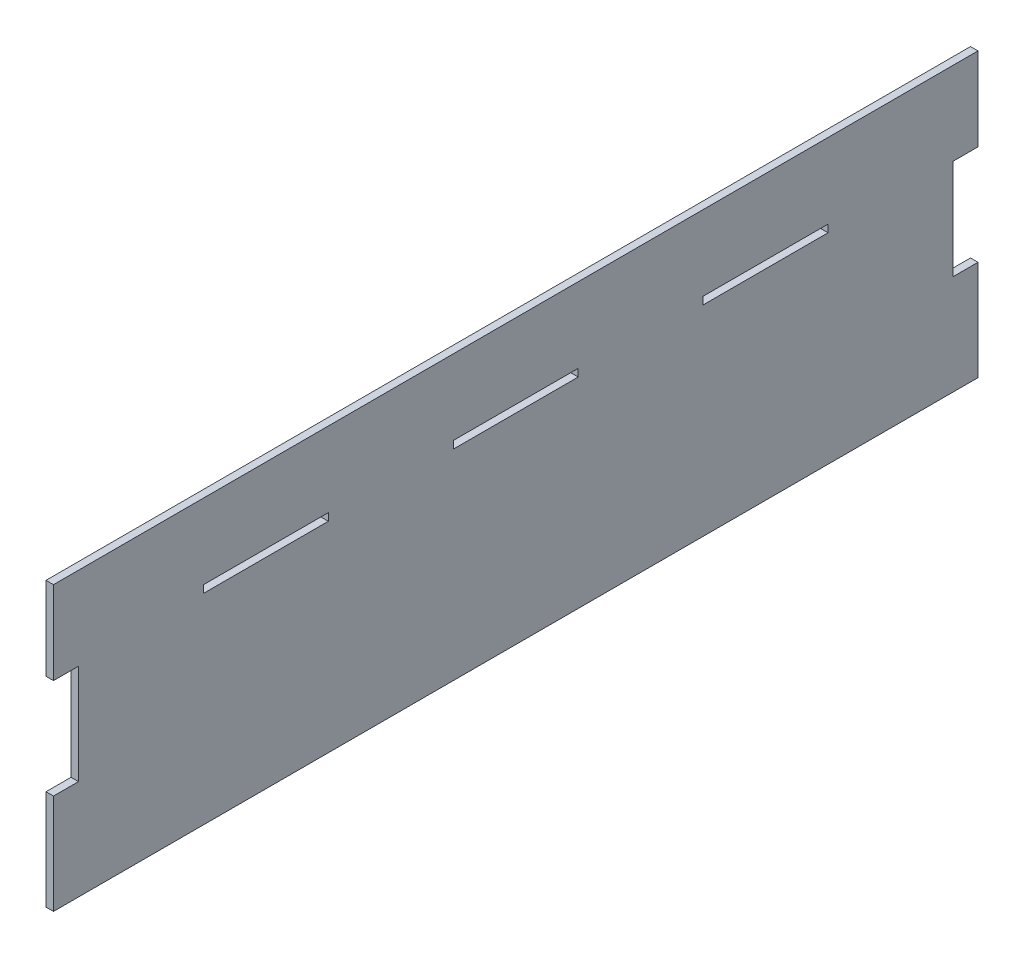
ISO-10303-21;
HEADER;
FILE_DESCRIPTION(('STEP AP214'),'2;1');
FILE_NAME('part.step','',(''),(''),'','','');
FILE_SCHEMA(('AUTOMOTIVE_DESIGN { 1 0 10303 214 1 1 1 1 }'));
ENDSEC;
DATA;
#1=APPLICATION_CONTEXT('core data for automotive mechanical design processes');
#2=APPLICATION_PROTOCOL_DEFINITION('international standard','automotive_design',2000,#1);
#3=PRODUCT_CONTEXT('',#1,'mechanical');
#4=PRODUCT('Part','Part','',(#3));
#5=PRODUCT_RELATED_PRODUCT_CATEGORY('part','',(#4));
#6=PRODUCT_DEFINITION_FORMATION('','',#4);
#7=PRODUCT_DEFINITION_CONTEXT('part definition',#1,'design');
#8=PRODUCT_DEFINITION('design','',#6,#7);
#9=PRODUCT_DEFINITION_SHAPE('','',#8);
#10=(LENGTH_UNIT() NAMED_UNIT(*) SI_UNIT(.MILLI.,.METRE.));
#11=(NAMED_UNIT(*) PLANE_ANGLE_UNIT() SI_UNIT($,.RADIAN.));
#12=(NAMED_UNIT(*) SI_UNIT($,.STERADIAN.) SOLID_ANGLE_UNIT());
#13=UNCERTAINTY_MEASURE_WITH_UNIT(LENGTH_MEASURE(1.E-05),#10,'distance_accuracy_value','');
#14=(GEOMETRIC_REPRESENTATION_CONTEXT(3) GLOBAL_UNCERTAINTY_ASSIGNED_CONTEXT((#13)) GLOBAL_UNIT_ASSIGNED_CONTEXT((#10,
#11,#12)) REPRESENTATION_CONTEXT('',''));
#15=CARTESIAN_POINT('',(0.,0.,0.));
#16=DIRECTION('',(0.,0.,1.));
#17=DIRECTION('',(1.,0.,0.));
#18=AXIS2_PLACEMENT_3D('',#15,#16,#17);
#19=CARTESIAN_POINT('',(3.,0.,0.));
#20=DIRECTION('',(-1.,0.,0.));
#21=DIRECTION('',(0.,0.,1.));
#22=AXIS2_PLACEMENT_3D('',#19,#20,#21);
#23=PLANE('',#22);
#24=DIRECTION('',(0.,-1.,0.));
#25=VECTOR('',#24,1.);
#26=CARTESIAN_POINT('',(3.,57.3835294117648,25.));
#27=LINE('',#26,#25);
#28=CARTESIAN_POINT('',(3.,60.3835294117648,25.));
#29=VERTEX_POINT('',#28);
#30=CARTESIAN_POINT('',(3.,57.3835294117648,25.));
#31=VERTEX_POINT('',#30);
#32=EDGE_CURVE('E249',#29,#31,#27,.T.);
#33=ORIENTED_EDGE('',*,*,#32,.F.);
#34=DIRECTION('',(0.,0.,1.));
#35=VECTOR('',#34,1.);
#36=CARTESIAN_POINT('',(3.,60.3835294117648,25.));
#37=LINE('',#36,#35);
#38=CARTESIAN_POINT('',(3.,60.3835294117648,-25.));
#39=VERTEX_POINT('',#38);
#40=EDGE_CURVE('E260',#39,#29,#37,.T.);
#41=ORIENTED_EDGE('',*,*,#40,.F.);
#42=DIRECTION('',(0.,1.,0.));
#43=VECTOR('',#42,1.);
#44=CARTESIAN_POINT('',(3.,57.3835294117648,-25.));
#45=LINE('',#44,#43);
#46=CARTESIAN_POINT('',(3.,57.3835294117648,-25.));
#47=VERTEX_POINT('',#46);
#48=EDGE_CURVE('E256',#47,#39,#45,.T.);
#49=ORIENTED_EDGE('',*,*,#48,.F.);
#50=DIRECTION('',(0.,0.,-1.));
#51=VECTOR('',#50,1.);
#52=CARTESIAN_POINT('',(3.,57.3835294117648,25.));
#53=LINE('',#52,#51);
#54=EDGE_CURVE('E252',#31,#47,#53,.T.);
#55=ORIENTED_EDGE('',*,*,#54,.F.);
#56=EDGE_LOOP('',(#33,#41,#49,#55));
#57=FACE_BOUND('',#56,.T.);
#58=DIRECTION('',(0.,-1.,0.));
#59=VECTOR('',#58,1.);
#60=CARTESIAN_POINT('',(3.,90.4235294117647,185.));
#61=LINE('',#60,#59);
#62=CARTESIAN_POINT('',(3.,90.4235294117647,185.));
#63=VERTEX_POINT('',#62);
#64=CARTESIAN_POINT('',(3.,57.1535294117648,185.));
#65=VERTEX_POINT('',#64);
#66=EDGE_CURVE('E335',#63,#65,#61,.T.);
#67=ORIENTED_EDGE('',*,*,#66,.T.);
#68=DIRECTION('',(0.,0.,-1.));
#69=VECTOR('',#68,1.);
#70=CARTESIAN_POINT('',(3.,57.1535294117648,175.));
#71=LINE('',#70,#69);
#72=CARTESIAN_POINT('',(3.,57.1535294117648,175.));
#73=VERTEX_POINT('',#72);
#74=EDGE_CURVE('E339',#65,#73,#71,.T.);
#75=ORIENTED_EDGE('',*,*,#74,.T.);
#76=DIRECTION('',(0.,-1.,0.));
#77=VECTOR('',#76,1.);
#78=CARTESIAN_POINT('',(3.,17.1535294117647,175.));
#79=LINE('',#78,#77);
#80=CARTESIAN_POINT('',(3.,17.1535294117647,175.));
#81=VERTEX_POINT('',#80);
#82=EDGE_CURVE('E343',#73,#81,#79,.T.);
#83=ORIENTED_EDGE('',*,*,#82,.T.);
#84=DIRECTION('',(0.,0.,1.));
#85=VECTOR('',#84,1.);
#86=CARTESIAN_POINT('',(3.,17.1535294117647,185.));
#87=LINE('',#86,#85);
#88=CARTESIAN_POINT('',(3.,17.1535294117647,185.));
#89=VERTEX_POINT('',#88);
#90=EDGE_CURVE('E346',#81,#89,#87,.T.);
#91=ORIENTED_EDGE('',*,*,#90,.T.);
#92=DIRECTION('',(0.,-1.,0.));
#93=VECTOR('',#92,1.);
#94=CARTESIAN_POINT('',(3.,17.1535294117647,185.));
#95=LINE('',#94,#93);
#96=CARTESIAN_POINT('',(3.,-22.8464705882353,185.));
#97=VERTEX_POINT('',#96);
#98=EDGE_CURVE('E349',#89,#97,#95,.T.);
#99=ORIENTED_EDGE('',*,*,#98,.T.);
#100=DIRECTION('',(0.,0.,-1.));
#101=VECTOR('',#100,1.);
#102=CARTESIAN_POINT('',(3.,-22.8464705882353,185.));
#103=LINE('',#102,#101);
#104=CARTESIAN_POINT('',(3.,-22.8464705882352,-185.));
#105=VERTEX_POINT('',#104);
#106=EDGE_CURVE('E352',#97,#105,#103,.T.);
#107=ORIENTED_EDGE('',*,*,#106,.T.);
#108=DIRECTION('',(0.,1.,0.));
#109=VECTOR('',#108,1.);
#110=CARTESIAN_POINT('',(3.,17.1535294117648,-185.));
#111=LINE('',#110,#109);
#112=CARTESIAN_POINT('',(3.,17.1535294117648,-185.));
#113=VERTEX_POINT('',#112);
#114=EDGE_CURVE('E355',#105,#113,#111,.T.);
#115=ORIENTED_EDGE('',*,*,#114,.T.);
#116=DIRECTION('',(0.,0.,1.));
#117=VECTOR('',#116,1.);
#118=CARTESIAN_POINT('',(3.,17.1535294117648,-185.));
#119=LINE('',#118,#117);
#120=CARTESIAN_POINT('',(3.,17.1535294117648,-175.));
#121=VERTEX_POINT('',#120);
#122=EDGE_CURVE('E358',#113,#121,#119,.T.);
#123=ORIENTED_EDGE('',*,*,#122,.T.);
#124=DIRECTION('',(0.,1.,0.));
#125=VECTOR('',#124,1.);
#126=CARTESIAN_POINT('',(3.,17.1535294117648,-175.));
#127=LINE('',#126,#125);
#128=CARTESIAN_POINT('',(3.,57.1535294117648,-175.));
#129=VERTEX_POINT('',#128);
#130=EDGE_CURVE('E361',#121,#129,#127,.T.);
#131=ORIENTED_EDGE('',*,*,#130,.T.);
#132=DIRECTION('',(0.,0.,-1.));
#133=VECTOR('',#132,1.);
#134=CARTESIAN_POINT('',(3.,57.1535294117648,-175.));
#135=LINE('',#134,#133);
#136=CARTESIAN_POINT('',(3.,57.1535294117648,-185.));
#137=VERTEX_POINT('',#136);
#138=EDGE_CURVE('E364',#129,#137,#135,.T.);
#139=ORIENTED_EDGE('',*,*,#138,.T.);
#140=DIRECTION('',(0.,1.,0.));
#141=VECTOR('',#140,1.);
#142=CARTESIAN_POINT('',(3.,90.4235294117648,-185.));
#143=LINE('',#142,#141);
#144=CARTESIAN_POINT('',(3.,90.4235294117648,-185.));
#145=VERTEX_POINT('',#144);
#146=EDGE_CURVE('E367',#137,#145,#143,.T.);
#147=ORIENTED_EDGE('',*,*,#146,.T.);
#148=DIRECTION('',(0.,0.,1.));
#149=VECTOR('',#148,1.);
#150=CARTESIAN_POINT('',(3.,90.4235294117648,-185.));
#151=LINE('',#150,#149);
#152=EDGE_CURVE('E370',#145,#63,#151,.T.);
#153=ORIENTED_EDGE('',*,*,#152,.T.);
#154=EDGE_LOOP('',(#67,#75,#83,#91,#99,#107,#115,#123,#131,#139,#147,#153));
#155=FACE_BOUND('',#154,.T.);
#156=DIRECTION('',(0.,-1.,0.));
#157=VECTOR('',#156,1.);
#158=CARTESIAN_POINT('',(3.,57.3835294117648,125.));
#159=LINE('',#158,#157);
#160=CARTESIAN_POINT('',(3.,60.3835294117648,125.));
#161=VERTEX_POINT('',#160);
#162=CARTESIAN_POINT('',(3.,57.3835294117648,125.));
#163=VERTEX_POINT('',#162);
#164=EDGE_CURVE('E292',#161,#163,#159,.T.);
#165=ORIENTED_EDGE('',*,*,#164,.F.);
#166=DIRECTION('',(0.,0.,1.));
#167=VECTOR('',#166,1.);
#168=CARTESIAN_POINT('',(3.,60.3835294117648,125.));
#169=LINE('',#168,#167);
#170=CARTESIAN_POINT('',(3.,60.3835294117648,75.));
#171=VERTEX_POINT('',#170);
#172=EDGE_CURVE('E303',#171,#161,#169,.T.);
#173=ORIENTED_EDGE('',*,*,#172,.F.);
#174=DIRECTION('',(0.,1.,0.));
#175=VECTOR('',#174,1.);
#176=CARTESIAN_POINT('',(3.,57.3835294117648,75.));
#177=LINE('',#176,#175);
#178=CARTESIAN_POINT('',(3.,57.3835294117648,75.));
#179=VERTEX_POINT('',#178);
#180=EDGE_CURVE('E299',#179,#171,#177,.T.);
#181=ORIENTED_EDGE('',*,*,#180,.F.);
#182=DIRECTION('',(0.,0.,-1.));
#183=VECTOR('',#182,1.);
#184=CARTESIAN_POINT('',(3.,57.3835294117648,125.));
#185=LINE('',#184,#183);
#186=EDGE_CURVE('E295',#163,#179,#185,.T.);
#187=ORIENTED_EDGE('',*,*,#186,.F.);
#188=EDGE_LOOP('',(#165,#173,#181,#187));
#189=FACE_BOUND('',#188,.T.);
#190=DIRECTION('',(0.,-1.,0.));
#191=VECTOR('',#190,1.);
#192=CARTESIAN_POINT('',(3.,57.3835294117648,-75.));
#193=LINE('',#192,#191);
#194=CARTESIAN_POINT('',(3.,60.3835294117648,-75.));
#195=VERTEX_POINT('',#194);
#196=CARTESIAN_POINT('',(3.,57.3835294117648,-75.));
#197=VERTEX_POINT('',#196);
#198=EDGE_CURVE('E201',#195,#197,#193,.T.);
#199=ORIENTED_EDGE('',*,*,#198,.F.);
#200=DIRECTION('',(0.,0.,1.));
#201=VECTOR('',#200,1.);
#202=CARTESIAN_POINT('',(3.,60.3835294117648,-75.));
#203=LINE('',#202,#201);
#204=CARTESIAN_POINT('',(3.,60.3835294117648,-125.));
#205=VERTEX_POINT('',#204);
#206=EDGE_CURVE('E227',#205,#195,#203,.T.);
#207=ORIENTED_EDGE('',*,*,#206,.F.);
#208=DIRECTION('',(0.,1.,0.));
#209=VECTOR('',#208,1.);
#210=CARTESIAN_POINT('',(3.,57.3835294117648,-125.));
#211=LINE('',#210,#209);
#212=CARTESIAN_POINT('',(3.,57.3835294117648,-125.));
#213=VERTEX_POINT('',#212);
#214=EDGE_CURVE('E223',#213,#205,#211,.T.);
#215=ORIENTED_EDGE('',*,*,#214,.F.);
#216=DIRECTION('',(0.,0.,-1.));
#217=VECTOR('',#216,1.);
#218=CARTESIAN_POINT('',(3.,57.3835294117648,-75.));
#219=LINE('',#218,#217);
#220=EDGE_CURVE('E210',#197,#213,#219,.T.);
#221=ORIENTED_EDGE('',*,*,#220,.F.);
#222=EDGE_LOOP('',(#199,#207,#215,#221));
#223=FACE_BOUND('',#222,.T.);
#224=ADVANCED_FACE('F39',(#57,#155,#189,#223),#23,.F.);
#225=CARTESIAN_POINT('',(0.,0.,0.));
#226=DIRECTION('',(-1.,0.,0.));
#227=DIRECTION('',(0.,0.,1.));
#228=AXIS2_PLACEMENT_3D('',#225,#226,#227);
#229=PLANE('',#228);
#230=DIRECTION('',(0.,-1.,0.));
#231=VECTOR('',#230,1.);
#232=CARTESIAN_POINT('',(0.,90.4235294117647,185.));
#233=LINE('',#232,#231);
#234=CARTESIAN_POINT('',(0.,90.4235294117647,185.));
#235=VERTEX_POINT('',#234);
#236=CARTESIAN_POINT('',(0.,57.1535294117648,185.));
#237=VERTEX_POINT('',#236);
#238=EDGE_CURVE('E334',#235,#237,#233,.T.);
#239=ORIENTED_EDGE('',*,*,#238,.F.);
#240=DIRECTION('',(0.,0.,1.));
#241=VECTOR('',#240,1.);
#242=CARTESIAN_POINT('',(0.,90.4235294117648,-185.));
#243=LINE('',#242,#241);
#244=CARTESIAN_POINT('',(0.,90.4235294117648,-185.));
#245=VERTEX_POINT('',#244);
#246=EDGE_CURVE('E340',#245,#235,#243,.T.);
#247=ORIENTED_EDGE('',*,*,#246,.F.);
#248=DIRECTION('',(0.,1.,0.));
#249=VECTOR('',#248,1.);
#250=CARTESIAN_POINT('',(0.,90.4235294117648,-185.));
#251=LINE('',#250,#249);
#252=CARTESIAN_POINT('',(0.,57.1535294117648,-185.));
#253=VERTEX_POINT('',#252);
#254=EDGE_CURVE('E404',#253,#245,#251,.T.);
#255=ORIENTED_EDGE('',*,*,#254,.F.);
#256=DIRECTION('',(0.,0.,-1.));
#257=VECTOR('',#256,1.);
#258=CARTESIAN_POINT('',(0.,57.1535294117648,-175.));
#259=LINE('',#258,#257);
#260=CARTESIAN_POINT('',(0.,57.1535294117648,-175.));
#261=VERTEX_POINT('',#260);
#262=EDGE_CURVE('E401',#261,#253,#259,.T.);
#263=ORIENTED_EDGE('',*,*,#262,.F.);
#264=DIRECTION('',(0.,1.,0.));
#265=VECTOR('',#264,1.);
#266=CARTESIAN_POINT('',(0.,17.1535294117648,-175.));
#267=LINE('',#266,#265);
#268=CARTESIAN_POINT('',(0.,17.1535294117648,-175.));
#269=VERTEX_POINT('',#268);
#270=EDGE_CURVE('E398',#269,#261,#267,.T.);
#271=ORIENTED_EDGE('',*,*,#270,.F.);
#272=DIRECTION('',(0.,0.,1.));
#273=VECTOR('',#272,1.);
#274=CARTESIAN_POINT('',(0.,17.1535294117648,-185.));
#275=LINE('',#274,#273);
#276=CARTESIAN_POINT('',(0.,17.1535294117648,-185.));
#277=VERTEX_POINT('',#276);
#278=EDGE_CURVE('E395',#277,#269,#275,.T.);
#279=ORIENTED_EDGE('',*,*,#278,.F.);
#280=DIRECTION('',(0.,1.,0.));
#281=VECTOR('',#280,1.);
#282=CARTESIAN_POINT('',(0.,17.1535294117648,-185.));
#283=LINE('',#282,#281);
#284=CARTESIAN_POINT('',(0.,-22.8464705882352,-185.));
#285=VERTEX_POINT('',#284);
#286=EDGE_CURVE('E392',#285,#277,#283,.T.);
#287=ORIENTED_EDGE('',*,*,#286,.F.);
#288=DIRECTION('',(0.,0.,-1.));
#289=VECTOR('',#288,1.);
#290=CARTESIAN_POINT('',(0.,-22.8464705882353,185.));
#291=LINE('',#290,#289);
#292=CARTESIAN_POINT('',(0.,-22.8464705882353,185.));
#293=VERTEX_POINT('',#292);
#294=EDGE_CURVE('E389',#293,#285,#291,.T.);
#295=ORIENTED_EDGE('',*,*,#294,.F.);
#296=DIRECTION('',(0.,-1.,0.));
#297=VECTOR('',#296,1.);
#298=CARTESIAN_POINT('',(0.,17.1535294117647,185.));
#299=LINE('',#298,#297);
#300=CARTESIAN_POINT('',(0.,17.1535294117647,185.));
#301=VERTEX_POINT('',#300);
#302=EDGE_CURVE('E386',#301,#293,#299,.T.);
#303=ORIENTED_EDGE('',*,*,#302,.F.);
#304=DIRECTION('',(0.,0.,1.));
#305=VECTOR('',#304,1.);
#306=CARTESIAN_POINT('',(0.,17.1535294117647,185.));
#307=LINE('',#306,#305);
#308=CARTESIAN_POINT('',(0.,17.1535294117647,175.));
#309=VERTEX_POINT('',#308);
#310=EDGE_CURVE('E383',#309,#301,#307,.T.);
#311=ORIENTED_EDGE('',*,*,#310,.F.);
#312=DIRECTION('',(0.,-1.,0.));
#313=VECTOR('',#312,1.);
#314=CARTESIAN_POINT('',(0.,17.1535294117647,175.));
#315=LINE('',#314,#313);
#316=CARTESIAN_POINT('',(0.,57.1535294117648,175.));
#317=VERTEX_POINT('',#316);
#318=EDGE_CURVE('E380',#317,#309,#315,.T.);
#319=ORIENTED_EDGE('',*,*,#318,.F.);
#320=DIRECTION('',(0.,0.,-1.));
#321=VECTOR('',#320,1.);
#322=CARTESIAN_POINT('',(0.,57.1535294117648,175.));
#323=LINE('',#322,#321);
#324=EDGE_CURVE('E377',#237,#317,#323,.T.);
#325=ORIENTED_EDGE('',*,*,#324,.F.);
#326=EDGE_LOOP('',(#239,#247,#255,#263,#271,#279,#287,#295,#303,#311,#319,#325));
#327=FACE_BOUND('',#326,.T.);
#328=DIRECTION('',(0.,0.,1.));
#329=VECTOR('',#328,1.);
#330=CARTESIAN_POINT('',(0.,60.3835294117648,125.));
#331=LINE('',#330,#329);
#332=CARTESIAN_POINT('',(0.,60.3835294117648,75.));
#333=VERTEX_POINT('',#332);
#334=CARTESIAN_POINT('',(0.,60.3835294117648,125.));
#335=VERTEX_POINT('',#334);
#336=EDGE_CURVE('E296',#333,#335,#331,.T.);
#337=ORIENTED_EDGE('',*,*,#336,.T.);
#338=DIRECTION('',(0.,-1.,0.));
#339=VECTOR('',#338,1.);
#340=CARTESIAN_POINT('',(0.,57.3835294117648,125.));
#341=LINE('',#340,#339);
#342=CARTESIAN_POINT('',(0.,57.3835294117648,125.));
#343=VERTEX_POINT('',#342);
#344=EDGE_CURVE('E291',#335,#343,#341,.T.);
#345=ORIENTED_EDGE('',*,*,#344,.T.);
#346=DIRECTION('',(0.,0.,-1.));
#347=VECTOR('',#346,1.);
#348=CARTESIAN_POINT('',(0.,57.3835294117648,125.));
#349=LINE('',#348,#347);
#350=CARTESIAN_POINT('',(0.,57.3835294117648,75.));
#351=VERTEX_POINT('',#350);
#352=EDGE_CURVE('E310',#343,#351,#349,.T.);
#353=ORIENTED_EDGE('',*,*,#352,.T.);
#354=DIRECTION('',(0.,1.,0.));
#355=VECTOR('',#354,1.);
#356=CARTESIAN_POINT('',(0.,57.3835294117648,75.));
#357=LINE('',#356,#355);
#358=EDGE_CURVE('E314',#351,#333,#357,.T.);
#359=ORIENTED_EDGE('',*,*,#358,.T.);
#360=EDGE_LOOP('',(#337,#345,#353,#359));
#361=FACE_BOUND('',#360,.T.);
#362=DIRECTION('',(0.,0.,1.));
#363=VECTOR('',#362,1.);
#364=CARTESIAN_POINT('',(0.,60.3835294117648,25.));
#365=LINE('',#364,#363);
#366=CARTESIAN_POINT('',(0.,60.3835294117648,-25.));
#367=VERTEX_POINT('',#366);
#368=CARTESIAN_POINT('',(0.,60.3835294117648,25.));
#369=VERTEX_POINT('',#368);
#370=EDGE_CURVE('E253',#367,#369,#365,.T.);
#371=ORIENTED_EDGE('',*,*,#370,.T.);
#372=DIRECTION('',(0.,-1.,0.));
#373=VECTOR('',#372,1.);
#374=CARTESIAN_POINT('',(0.,57.3835294117648,25.));
#375=LINE('',#374,#373);
#376=CARTESIAN_POINT('',(0.,57.3835294117648,25.));
#377=VERTEX_POINT('',#376);
#378=EDGE_CURVE('E219',#369,#377,#375,.T.);
#379=ORIENTED_EDGE('',*,*,#378,.T.);
#380=DIRECTION('',(0.,0.,-1.));
#381=VECTOR('',#380,1.);
#382=CARTESIAN_POINT('',(0.,57.3835294117648,25.));
#383=LINE('',#382,#381);
#384=CARTESIAN_POINT('',(0.,57.3835294117648,-25.));
#385=VERTEX_POINT('',#384);
#386=EDGE_CURVE('E267',#377,#385,#383,.T.);
#387=ORIENTED_EDGE('',*,*,#386,.T.);
#388=DIRECTION('',(0.,1.,0.));
#389=VECTOR('',#388,1.);
#390=CARTESIAN_POINT('',(0.,57.3835294117648,-25.));
#391=LINE('',#390,#389);
#392=EDGE_CURVE('E271',#385,#367,#391,.T.);
#393=ORIENTED_EDGE('',*,*,#392,.T.);
#394=EDGE_LOOP('',(#371,#379,#387,#393));
#395=FACE_BOUND('',#394,.T.);
#396=DIRECTION('',(0.,0.,1.));
#397=VECTOR('',#396,1.);
#398=CARTESIAN_POINT('',(0.,60.3835294117648,-75.));
#399=LINE('',#398,#397);
#400=CARTESIAN_POINT('',(0.,60.3835294117648,-125.));
#401=VERTEX_POINT('',#400);
#402=CARTESIAN_POINT('',(0.,60.3835294117648,-75.));
#403=VERTEX_POINT('',#402);
#404=EDGE_CURVE('E211',#401,#403,#399,.T.);
#405=ORIENTED_EDGE('',*,*,#404,.T.);
#406=DIRECTION('',(0.,-1.,0.));
#407=VECTOR('',#406,1.);
#408=CARTESIAN_POINT('',(0.,57.3835294117648,-75.));
#409=LINE('',#408,#407);
#410=CARTESIAN_POINT('',(0.,57.3835294117648,-75.));
#411=VERTEX_POINT('',#410);
#412=EDGE_CURVE('E63',#403,#411,#409,.T.);
#413=ORIENTED_EDGE('',*,*,#412,.T.);
#414=DIRECTION('',(0.,0.,-1.));
#415=VECTOR('',#414,1.);
#416=CARTESIAN_POINT('',(0.,57.3835294117648,-75.));
#417=LINE('',#416,#415);
#418=CARTESIAN_POINT('',(0.,57.3835294117648,-125.));
#419=VERTEX_POINT('',#418);
#420=EDGE_CURVE('E217',#411,#419,#417,.T.);
#421=ORIENTED_EDGE('',*,*,#420,.T.);
#422=DIRECTION('',(0.,1.,0.));
#423=VECTOR('',#422,1.);
#424=CARTESIAN_POINT('',(0.,57.3835294117648,-125.));
#425=LINE('',#424,#423);
#426=EDGE_CURVE('E236',#419,#401,#425,.T.);
#427=ORIENTED_EDGE('',*,*,#426,.T.);
#428=EDGE_LOOP('',(#405,#413,#421,#427));
#429=FACE_BOUND('',#428,.T.);
#430=ADVANCED_FACE('F459',(#327,#361,#395,#429),#229,.T.);
#431=CARTESIAN_POINT('',(3.,90.4235294117647,185.));
#432=DIRECTION('',(0.,0.,-1.));
#433=DIRECTION('',(-1.,0.,0.));
#434=AXIS2_PLACEMENT_3D('',#431,#432,#433);
#435=PLANE('',#434);
#436=ORIENTED_EDGE('',*,*,#238,.T.);
#437=DIRECTION('',(-1.,0.,0.));
#438=VECTOR('',#437,1.);
#439=CARTESIAN_POINT('',(3.,57.1535294117648,185.));
#440=LINE('',#439,#438);
#441=EDGE_CURVE('E11',#65,#237,#440,.T.);
#442=ORIENTED_EDGE('',*,*,#441,.F.);
#443=ORIENTED_EDGE('',*,*,#66,.F.);
#444=DIRECTION('',(-1.,0.,0.));
#445=VECTOR('',#444,1.);
#446=CARTESIAN_POINT('',(3.,90.4235294117647,185.));
#447=LINE('',#446,#445);
#448=EDGE_CURVE('E373',#63,#235,#447,.T.);
#449=ORIENTED_EDGE('',*,*,#448,.T.);
#450=EDGE_LOOP('',(#436,#442,#443,#449));
#451=FACE_BOUND('',#450,.T.);
#452=ADVANCED_FACE('F41',(#451),#435,.F.);
#453=CARTESIAN_POINT('',(3.,57.1535294117648,175.));
#454=DIRECTION('',(0.,1.,0.));
#455=DIRECTION('',(0.,0.,1.));
#456=AXIS2_PLACEMENT_3D('',#453,#454,#455);
#457=PLANE('',#456);
#458=ORIENTED_EDGE('',*,*,#324,.T.);
#459=DIRECTION('',(-1.,0.,0.));
#460=VECTOR('',#459,1.);
#461=CARTESIAN_POINT('',(3.,57.1535294117648,175.));
#462=LINE('',#461,#460);
#463=EDGE_CURVE('E48',#73,#317,#462,.T.);
#464=ORIENTED_EDGE('',*,*,#463,.F.);
#465=ORIENTED_EDGE('',*,*,#74,.F.);
#466=ORIENTED_EDGE('',*,*,#441,.T.);
#467=EDGE_LOOP('',(#458,#464,#465,#466));
#468=FACE_BOUND('',#467,.T.);
#469=ADVANCED_FACE('F477',(#468),#457,.F.);
#470=CARTESIAN_POINT('',(3.,17.1535294117647,175.));
#471=DIRECTION('',(0.,0.,-1.));
#472=DIRECTION('',(0.,1.,0.));
#473=AXIS2_PLACEMENT_3D('',#470,#471,#472);
#474=PLANE('',#473);
#475=ORIENTED_EDGE('',*,*,#318,.T.);
#476=DIRECTION('',(-1.,0.,0.));
#477=VECTOR('',#476,1.);
#478=CARTESIAN_POINT('',(3.,17.1535294117647,175.));
#479=LINE('',#478,#477);
#480=EDGE_CURVE('E444',#81,#309,#479,.T.);
#481=ORIENTED_EDGE('',*,*,#480,.F.);
#482=ORIENTED_EDGE('',*,*,#82,.F.);
#483=ORIENTED_EDGE('',*,*,#463,.T.);
#484=EDGE_LOOP('',(#475,#481,#482,#483));
#485=FACE_BOUND('',#484,.T.);
#486=ADVANCED_FACE('F453',(#485),#474,.F.);
#487=CARTESIAN_POINT('',(3.,17.1535294117647,185.));
#488=DIRECTION('',(0.,-1.,0.));
#489=DIRECTION('',(0.,0.,-1.));
#490=AXIS2_PLACEMENT_3D('',#487,#488,#489);
#491=PLANE('',#490);
#492=ORIENTED_EDGE('',*,*,#310,.T.);
#493=DIRECTION('',(-1.,0.,0.));
#494=VECTOR('',#493,1.);
#495=CARTESIAN_POINT('',(3.,17.1535294117647,185.));
#496=LINE('',#495,#494);
#497=EDGE_CURVE('E440',#89,#301,#496,.T.);
#498=ORIENTED_EDGE('',*,*,#497,.F.);
#499=ORIENTED_EDGE('',*,*,#90,.F.);
#500=ORIENTED_EDGE('',*,*,#480,.T.);
#501=EDGE_LOOP('',(#492,#498,#499,#500));
#502=FACE_BOUND('',#501,.T.);
#503=ADVANCED_FACE('F465',(#502),#491,.F.);
#504=CARTESIAN_POINT('',(3.,17.1535294117647,185.));
#505=DIRECTION('',(0.,0.,-1.));
#506=DIRECTION('',(-1.,0.,0.));
#507=AXIS2_PLACEMENT_3D('',#504,#505,#506);
#508=PLANE('',#507);
#509=ORIENTED_EDGE('',*,*,#302,.T.);
#510=DIRECTION('',(-1.,0.,0.));
#511=VECTOR('',#510,1.);
#512=CARTESIAN_POINT('',(3.,-22.8464705882353,185.));
#513=LINE('',#512,#511);
#514=EDGE_CURVE('E436',#97,#293,#513,.T.);
#515=ORIENTED_EDGE('',*,*,#514,.F.);
#516=ORIENTED_EDGE('',*,*,#98,.F.);
#517=ORIENTED_EDGE('',*,*,#497,.T.);
#518=EDGE_LOOP('',(#509,#515,#516,#517));
#519=FACE_BOUND('',#518,.T.);
#520=ADVANCED_FACE('F469',(#519),#508,.F.);
#521=CARTESIAN_POINT('',(3.,-22.8464705882353,185.));
#522=DIRECTION('',(0.,1.,0.));
#523=DIRECTION('',(0.,0.,1.));
#524=AXIS2_PLACEMENT_3D('',#521,#522,#523);
#525=PLANE('',#524);
#526=ORIENTED_EDGE('',*,*,#294,.T.);
#527=DIRECTION('',(-1.,0.,0.));
#528=VECTOR('',#527,1.);
#529=CARTESIAN_POINT('',(3.,-22.8464705882352,-185.));
#530=LINE('',#529,#528);
#531=EDGE_CURVE('E432',#105,#285,#530,.T.);
#532=ORIENTED_EDGE('',*,*,#531,.F.);
#533=ORIENTED_EDGE('',*,*,#106,.F.);
#534=ORIENTED_EDGE('',*,*,#514,.T.);
#535=EDGE_LOOP('',(#526,#532,#533,#534));
#536=FACE_BOUND('',#535,.T.);
#537=ADVANCED_FACE('F510',(#536),#525,.F.);
#538=CARTESIAN_POINT('',(3.,17.1535294117648,-185.));
#539=DIRECTION('',(0.,0.,1.));
#540=DIRECTION('',(0.,-1.,0.));
#541=AXIS2_PLACEMENT_3D('',#538,#539,#540);
#542=PLANE('',#541);
#543=ORIENTED_EDGE('',*,*,#286,.T.);
#544=DIRECTION('',(-1.,0.,0.));
#545=VECTOR('',#544,1.);
#546=CARTESIAN_POINT('',(3.,17.1535294117648,-185.));
#547=LINE('',#546,#545);
#548=EDGE_CURVE('E428',#113,#277,#547,.T.);
#549=ORIENTED_EDGE('',*,*,#548,.F.);
#550=ORIENTED_EDGE('',*,*,#114,.F.);
#551=ORIENTED_EDGE('',*,*,#531,.T.);
#552=EDGE_LOOP('',(#543,#549,#550,#551));
#553=FACE_BOUND('',#552,.T.);
#554=ADVANCED_FACE('F508',(#553),#542,.F.);
#555=CARTESIAN_POINT('',(3.,17.1535294117648,-185.));
#556=DIRECTION('',(0.,-1.,0.));
#557=DIRECTION('',(0.,0.,-1.));
#558=AXIS2_PLACEMENT_3D('',#555,#556,#557);
#559=PLANE('',#558);
#560=ORIENTED_EDGE('',*,*,#278,.T.);
#561=DIRECTION('',(-1.,0.,0.));
#562=VECTOR('',#561,1.);
#563=CARTESIAN_POINT('',(3.,17.1535294117648,-175.));
#564=LINE('',#563,#562);
#565=EDGE_CURVE('E424',#121,#269,#564,.T.);
#566=ORIENTED_EDGE('',*,*,#565,.F.);
#567=ORIENTED_EDGE('',*,*,#122,.F.);
#568=ORIENTED_EDGE('',*,*,#548,.T.);
#569=EDGE_LOOP('',(#560,#566,#567,#568));
#570=FACE_BOUND('',#569,.T.);
#571=ADVANCED_FACE('F504',(#570),#559,.F.);
#572=CARTESIAN_POINT('',(3.,17.1535294117648,-175.));
#573=DIRECTION('',(0.,0.,1.));
#574=DIRECTION('',(0.,-1.,0.));
#575=AXIS2_PLACEMENT_3D('',#572,#573,#574);
#576=PLANE('',#575);
#577=ORIENTED_EDGE('',*,*,#270,.T.);
#578=DIRECTION('',(-1.,0.,0.));
#579=VECTOR('',#578,1.);
#580=CARTESIAN_POINT('',(3.,57.1535294117648,-175.));
#581=LINE('',#580,#579);
#582=EDGE_CURVE('E420',#129,#261,#581,.T.);
#583=ORIENTED_EDGE('',*,*,#582,.F.);
#584=ORIENTED_EDGE('',*,*,#130,.F.);
#585=ORIENTED_EDGE('',*,*,#565,.T.);
#586=EDGE_LOOP('',(#577,#583,#584,#585));
#587=FACE_BOUND('',#586,.T.);
#588=ADVANCED_FACE('F499',(#587),#576,.F.);
#589=CARTESIAN_POINT('',(3.,57.1535294117648,-175.));
#590=DIRECTION('',(0.,1.,0.));
#591=DIRECTION('',(0.,0.,1.));
#592=AXIS2_PLACEMENT_3D('',#589,#590,#591);
#593=PLANE('',#592);
#594=ORIENTED_EDGE('',*,*,#262,.T.);
#595=DIRECTION('',(-1.,0.,0.));
#596=VECTOR('',#595,1.);
#597=CARTESIAN_POINT('',(3.,57.1535294117648,-185.));
#598=LINE('',#597,#596);
#599=EDGE_CURVE('E416',#137,#253,#598,.T.);
#600=ORIENTED_EDGE('',*,*,#599,.F.);
#601=ORIENTED_EDGE('',*,*,#138,.F.);
#602=ORIENTED_EDGE('',*,*,#582,.T.);
#603=EDGE_LOOP('',(#594,#600,#601,#602));
#604=FACE_BOUND('',#603,.T.);
#605=ADVANCED_FACE('F493',(#604),#593,.F.);
#606=CARTESIAN_POINT('',(3.,90.4235294117648,-185.));
#607=DIRECTION('',(0.,0.,1.));
#608=DIRECTION('',(1.,0.,0.));
#609=AXIS2_PLACEMENT_3D('',#606,#607,#608);
#610=PLANE('',#609);
#611=ORIENTED_EDGE('',*,*,#254,.T.);
#612=DIRECTION('',(-1.,0.,0.));
#613=VECTOR('',#612,1.);
#614=CARTESIAN_POINT('',(3.,90.4235294117648,-185.));
#615=LINE('',#614,#613);
#616=EDGE_CURVE('E412',#145,#245,#615,.T.);
#617=ORIENTED_EDGE('',*,*,#616,.F.);
#618=ORIENTED_EDGE('',*,*,#146,.F.);
#619=ORIENTED_EDGE('',*,*,#599,.T.);
#620=EDGE_LOOP('',(#611,#617,#618,#619));
#621=FACE_BOUND('',#620,.T.);
#622=ADVANCED_FACE('F489',(#621),#610,.F.);
#623=CARTESIAN_POINT('',(3.,90.4235294117648,-185.));
#624=DIRECTION('',(0.,-1.,0.));
#625=DIRECTION('',(0.,0.,-1.));
#626=AXIS2_PLACEMENT_3D('',#623,#624,#625);
#627=PLANE('',#626);
#628=ORIENTED_EDGE('',*,*,#246,.T.);
#629=ORIENTED_EDGE('',*,*,#448,.F.);
#630=ORIENTED_EDGE('',*,*,#152,.F.);
#631=ORIENTED_EDGE('',*,*,#616,.T.);
#632=EDGE_LOOP('',(#628,#629,#630,#631));
#633=FACE_BOUND('',#632,.T.);
#634=ADVANCED_FACE('F484',(#633),#627,.F.);
#635=CARTESIAN_POINT('',(3.,57.3835294117648,125.));
#636=DIRECTION('',(0.,0.,-1.));
#637=DIRECTION('',(-1.,0.,0.));
#638=AXIS2_PLACEMENT_3D('',#635,#636,#637);
#639=PLANE('',#638);
#640=ORIENTED_EDGE('',*,*,#344,.F.);
#641=DIRECTION('',(-1.,0.,0.));
#642=VECTOR('',#641,1.);
#643=CARTESIAN_POINT('',(3.,60.3835294117648,125.));
#644=LINE('',#643,#642);
#645=EDGE_CURVE('E306',#161,#335,#644,.T.);
#646=ORIENTED_EDGE('',*,*,#645,.F.);
#647=ORIENTED_EDGE('',*,*,#164,.T.);
#648=DIRECTION('',(-1.,0.,0.));
#649=VECTOR('',#648,1.);
#650=CARTESIAN_POINT('',(3.,57.3835294117648,125.));
#651=LINE('',#650,#649);
#652=EDGE_CURVE('E330',#163,#343,#651,.T.);
#653=ORIENTED_EDGE('',*,*,#652,.T.);
#654=EDGE_LOOP('',(#640,#646,#647,#653));
#655=FACE_BOUND('',#654,.T.);
#656=ADVANCED_FACE('F528',(#655),#639,.T.);
#657=CARTESIAN_POINT('',(3.,57.3835294117648,125.));
#658=DIRECTION('',(0.,1.,0.));
#659=DIRECTION('',(0.,0.,1.));
#660=AXIS2_PLACEMENT_3D('',#657,#658,#659);
#661=PLANE('',#660);
#662=ORIENTED_EDGE('',*,*,#352,.F.);
#663=ORIENTED_EDGE('',*,*,#652,.F.);
#664=ORIENTED_EDGE('',*,*,#186,.T.);
#665=DIRECTION('',(-1.,0.,0.));
#666=VECTOR('',#665,1.);
#667=CARTESIAN_POINT('',(3.,57.3835294117648,75.));
#668=LINE('',#667,#666);
#669=EDGE_CURVE('E327',#179,#351,#668,.T.);
#670=ORIENTED_EDGE('',*,*,#669,.T.);
#671=EDGE_LOOP('',(#662,#663,#664,#670));
#672=FACE_BOUND('',#671,.T.);
#673=ADVANCED_FACE('F566',(#672),#661,.T.);
#674=CARTESIAN_POINT('',(3.,57.3835294117648,75.));
#675=DIRECTION('',(0.,0.,1.));
#676=DIRECTION('',(1.,0.,0.));
#677=AXIS2_PLACEMENT_3D('',#674,#675,#676);
#678=PLANE('',#677);
#679=ORIENTED_EDGE('',*,*,#358,.F.);
#680=ORIENTED_EDGE('',*,*,#669,.F.);
#681=ORIENTED_EDGE('',*,*,#180,.T.);
#682=DIRECTION('',(-1.,0.,0.));
#683=VECTOR('',#682,1.);
#684=CARTESIAN_POINT('',(3.,60.3835294117648,75.));
#685=LINE('',#684,#683);
#686=EDGE_CURVE('E324',#171,#333,#685,.T.);
#687=ORIENTED_EDGE('',*,*,#686,.T.);
#688=EDGE_LOOP('',(#679,#680,#681,#687));
#689=FACE_BOUND('',#688,.T.);
#690=ADVANCED_FACE('F573',(#689),#678,.T.);
#691=CARTESIAN_POINT('',(3.,60.3835294117648,125.));
#692=DIRECTION('',(0.,-1.,0.));
#693=DIRECTION('',(0.,0.,-1.));
#694=AXIS2_PLACEMENT_3D('',#691,#692,#693);
#695=PLANE('',#694);
#696=ORIENTED_EDGE('',*,*,#336,.F.);
#697=ORIENTED_EDGE('',*,*,#686,.F.);
#698=ORIENTED_EDGE('',*,*,#172,.T.);
#699=ORIENTED_EDGE('',*,*,#645,.T.);
#700=EDGE_LOOP('',(#696,#697,#698,#699));
#701=FACE_BOUND('',#700,.T.);
#702=ADVANCED_FACE('F580',(#701),#695,.T.);
#703=CARTESIAN_POINT('',(3.,57.3835294117648,25.));
#704=DIRECTION('',(0.,0.,-1.));
#705=DIRECTION('',(-1.,0.,0.));
#706=AXIS2_PLACEMENT_3D('',#703,#704,#705);
#707=PLANE('',#706);
#708=ORIENTED_EDGE('',*,*,#378,.F.);
#709=DIRECTION('',(-1.,0.,0.));
#710=VECTOR('',#709,1.);
#711=CARTESIAN_POINT('',(3.,60.3835294117648,25.));
#712=LINE('',#711,#710);
#713=EDGE_CURVE('E263',#29,#369,#712,.T.);
#714=ORIENTED_EDGE('',*,*,#713,.F.);
#715=ORIENTED_EDGE('',*,*,#32,.T.);
#716=DIRECTION('',(-1.,0.,0.));
#717=VECTOR('',#716,1.);
#718=CARTESIAN_POINT('',(3.,57.3835294117648,25.));
#719=LINE('',#718,#717);
#720=EDGE_CURVE('E287',#31,#377,#719,.T.);
#721=ORIENTED_EDGE('',*,*,#720,.T.);
#722=EDGE_LOOP('',(#708,#714,#715,#721));
#723=FACE_BOUND('',#722,.T.);
#724=ADVANCED_FACE('F588',(#723),#707,.T.);
#725=CARTESIAN_POINT('',(3.,57.3835294117648,25.));
#726=DIRECTION('',(0.,1.,0.));
#727=DIRECTION('',(0.,0.,1.));
#728=AXIS2_PLACEMENT_3D('',#725,#726,#727);
#729=PLANE('',#728);
#730=ORIENTED_EDGE('',*,*,#386,.F.);
#731=ORIENTED_EDGE('',*,*,#720,.F.);
#732=ORIENTED_EDGE('',*,*,#54,.T.);
#733=DIRECTION('',(-1.,0.,0.));
#734=VECTOR('',#733,1.);
#735=CARTESIAN_POINT('',(3.,57.3835294117648,-25.));
#736=LINE('',#735,#734);
#737=EDGE_CURVE('E284',#47,#385,#736,.T.);
#738=ORIENTED_EDGE('',*,*,#737,.T.);
#739=EDGE_LOOP('',(#730,#731,#732,#738));
#740=FACE_BOUND('',#739,.T.);
#741=ADVANCED_FACE('F596',(#740),#729,.T.);
#742=CARTESIAN_POINT('',(3.,57.3835294117648,-25.));
#743=DIRECTION('',(0.,0.,1.));
#744=DIRECTION('',(0.,-1.,0.));
#745=AXIS2_PLACEMENT_3D('',#742,#743,#744);
#746=PLANE('',#745);
#747=ORIENTED_EDGE('',*,*,#392,.F.);
#748=ORIENTED_EDGE('',*,*,#737,.F.);
#749=ORIENTED_EDGE('',*,*,#48,.T.);
#750=DIRECTION('',(-1.,0.,0.));
#751=VECTOR('',#750,1.);
#752=CARTESIAN_POINT('',(3.,60.3835294117648,-25.));
#753=LINE('',#752,#751);
#754=EDGE_CURVE('E281',#39,#367,#753,.T.);
#755=ORIENTED_EDGE('',*,*,#754,.T.);
#756=EDGE_LOOP('',(#747,#748,#749,#755));
#757=FACE_BOUND('',#756,.T.);
#758=ADVANCED_FACE('F604',(#757),#746,.T.);
#759=CARTESIAN_POINT('',(3.,60.3835294117648,25.));
#760=DIRECTION('',(0.,-1.,0.));
#761=DIRECTION('',(0.,0.,-1.));
#762=AXIS2_PLACEMENT_3D('',#759,#760,#761);
#763=PLANE('',#762);
#764=ORIENTED_EDGE('',*,*,#370,.F.);
#765=ORIENTED_EDGE('',*,*,#754,.F.);
#766=ORIENTED_EDGE('',*,*,#40,.T.);
#767=ORIENTED_EDGE('',*,*,#713,.T.);
#768=EDGE_LOOP('',(#764,#765,#766,#767));
#769=FACE_BOUND('',#768,.T.);
#770=ADVANCED_FACE('F612',(#769),#763,.T.);
#771=CARTESIAN_POINT('',(3.,57.3835294117648,-75.));
#772=DIRECTION('',(0.,0.,-1.));
#773=DIRECTION('',(-1.,0.,0.));
#774=AXIS2_PLACEMENT_3D('',#771,#772,#773);
#775=PLANE('',#774);
#776=ORIENTED_EDGE('',*,*,#412,.F.);
#777=DIRECTION('',(-1.,0.,0.));
#778=VECTOR('',#777,1.);
#779=CARTESIAN_POINT('',(3.,60.3835294117648,-75.));
#780=LINE('',#779,#778);
#781=EDGE_CURVE('E205',#195,#403,#780,.T.);
#782=ORIENTED_EDGE('',*,*,#781,.F.);
#783=ORIENTED_EDGE('',*,*,#198,.T.);
#784=DIRECTION('',(-1.,0.,0.));
#785=VECTOR('',#784,1.);
#786=CARTESIAN_POINT('',(3.,57.3835294117648,-75.));
#787=LINE('',#786,#785);
#788=EDGE_CURVE('E204',#197,#411,#787,.T.);
#789=ORIENTED_EDGE('',*,*,#788,.T.);
#790=EDGE_LOOP('',(#776,#782,#783,#789));
#791=FACE_BOUND('',#790,.T.);
#792=ADVANCED_FACE('F203',(#791),#775,.T.);
#793=CARTESIAN_POINT('',(3.,57.3835294117648,-75.));
#794=DIRECTION('',(0.,1.,0.));
#795=DIRECTION('',(0.,0.,1.));
#796=AXIS2_PLACEMENT_3D('',#793,#794,#795);
#797=PLANE('',#796);
#798=ORIENTED_EDGE('',*,*,#420,.F.);
#799=ORIENTED_EDGE('',*,*,#788,.F.);
#800=ORIENTED_EDGE('',*,*,#220,.T.);
#801=DIRECTION('',(-1.,0.,0.));
#802=VECTOR('',#801,1.);
#803=CARTESIAN_POINT('',(3.,57.3835294117648,-125.));
#804=LINE('',#803,#802);
#805=EDGE_CURVE('E220',#213,#419,#804,.T.);
#806=ORIENTED_EDGE('',*,*,#805,.T.);
#807=EDGE_LOOP('',(#798,#799,#800,#806));
#808=FACE_BOUND('',#807,.T.);
#809=ADVANCED_FACE('F214',(#808),#797,.T.);
#810=CARTESIAN_POINT('',(3.,57.3835294117648,-125.));
#811=DIRECTION('',(0.,0.,1.));
#812=DIRECTION('',(1.,0.,0.));
#813=AXIS2_PLACEMENT_3D('',#810,#811,#812);
#814=PLANE('',#813);
#815=ORIENTED_EDGE('',*,*,#426,.F.);
#816=ORIENTED_EDGE('',*,*,#805,.F.);
#817=ORIENTED_EDGE('',*,*,#214,.T.);
#818=DIRECTION('',(-1.,0.,0.));
#819=VECTOR('',#818,1.);
#820=CARTESIAN_POINT('',(3.,60.3835294117648,-125.));
#821=LINE('',#820,#819);
#822=EDGE_CURVE('E55',#205,#401,#821,.T.);
#823=ORIENTED_EDGE('',*,*,#822,.T.);
#824=EDGE_LOOP('',(#815,#816,#817,#823));
#825=FACE_BOUND('',#824,.T.);
#826=ADVANCED_FACE('F633',(#825),#814,.T.);
#827=CARTESIAN_POINT('',(3.,60.3835294117648,-75.));
#828=DIRECTION('',(0.,-1.,0.));
#829=DIRECTION('',(0.,0.,-1.));
#830=AXIS2_PLACEMENT_3D('',#827,#828,#829);
#831=PLANE('',#830);
#832=ORIENTED_EDGE('',*,*,#404,.F.);
#833=ORIENTED_EDGE('',*,*,#822,.F.);
#834=ORIENTED_EDGE('',*,*,#206,.T.);
#835=ORIENTED_EDGE('',*,*,#781,.T.);
#836=EDGE_LOOP('',(#832,#833,#834,#835));
#837=FACE_BOUND('',#836,.T.);
#838=ADVANCED_FACE('F640',(#837),#831,.T.);
#839=CLOSED_SHELL('',(#224,#430,#452,#469,#486,#503,#520,#537,#554,#571,#588,#605,#622,#634,
#656,#673,#690,#702,#724,#741,#758,#770,#792,#809,#826,#838));
#840=MANIFOLD_SOLID_BREP('B2',#839);
#841=ADVANCED_BREP_SHAPE_REPRESENTATION('',(#18,#840),#14);
#842=SHAPE_DEFINITION_REPRESENTATION(#9,#841);
ENDSEC;
END-ISO-10303-21;
